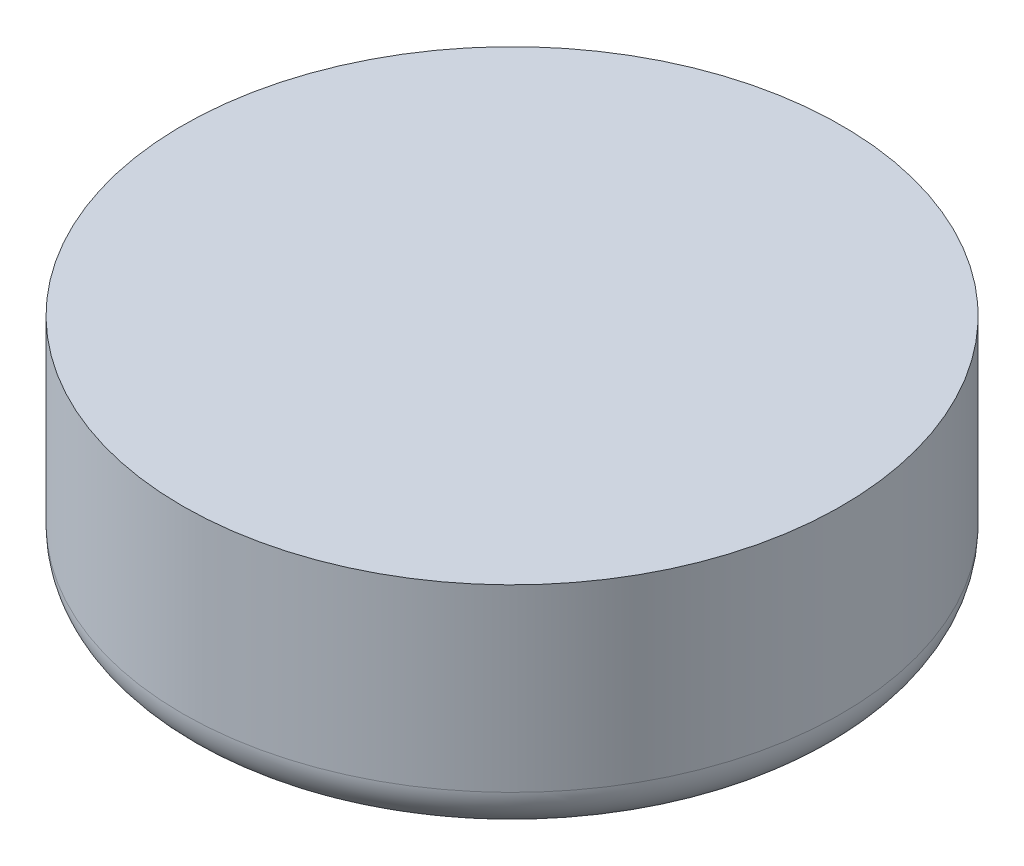
ISO-10303-21;
HEADER;
FILE_DESCRIPTION(('STEP AP214'),'2;1');
FILE_NAME('part.step','',(''),(''),'','','');
FILE_SCHEMA(('AUTOMOTIVE_DESIGN { 1 0 10303 214 1 1 1 1 }'));
ENDSEC;
DATA;
#1=APPLICATION_CONTEXT('core data for automotive mechanical design processes');
#2=APPLICATION_PROTOCOL_DEFINITION('international standard','automotive_design',2000,#1);
#3=PRODUCT_CONTEXT('',#1,'mechanical');
#4=PRODUCT('Part','Part','',(#3));
#5=PRODUCT_RELATED_PRODUCT_CATEGORY('part','',(#4));
#6=PRODUCT_DEFINITION_FORMATION('','',#4);
#7=PRODUCT_DEFINITION_CONTEXT('part definition',#1,'design');
#8=PRODUCT_DEFINITION('design','',#6,#7);
#9=PRODUCT_DEFINITION_SHAPE('','',#8);
#10=(LENGTH_UNIT() NAMED_UNIT(*) SI_UNIT(.MILLI.,.METRE.));
#11=(NAMED_UNIT(*) PLANE_ANGLE_UNIT() SI_UNIT($,.RADIAN.));
#12=(NAMED_UNIT(*) SI_UNIT($,.STERADIAN.) SOLID_ANGLE_UNIT());
#13=UNCERTAINTY_MEASURE_WITH_UNIT(LENGTH_MEASURE(1.E-05),#10,'distance_accuracy_value','');
#14=(GEOMETRIC_REPRESENTATION_CONTEXT(3) GLOBAL_UNCERTAINTY_ASSIGNED_CONTEXT((#13)) GLOBAL_UNIT_ASSIGNED_CONTEXT((#10,
#11,#12)) REPRESENTATION_CONTEXT('',''));
#15=CARTESIAN_POINT('',(0.,0.,0.));
#16=DIRECTION('',(0.,0.,1.));
#17=DIRECTION('',(1.,0.,0.));
#18=AXIS2_PLACEMENT_3D('',#15,#16,#17);
#19=CARTESIAN_POINT('',(0.,15.,0.));
#20=DIRECTION('',(0.,-1.,0.));
#21=DIRECTION('',(0.,0.,-1.));
#22=AXIS2_PLACEMENT_3D('',#19,#20,#21);
#23=CYLINDRICAL_SURFACE('',#22,22.);
#24=CARTESIAN_POINT('',(0.,3.,0.));
#25=DIRECTION('',(0.,1.,0.));
#26=DIRECTION('',(0.,0.,1.));
#27=AXIS2_PLACEMENT_3D('',#24,#25,#26);
#28=CIRCLE('',#27,22.);
#29=CARTESIAN_POINT('',(0.,3.,22.));
#30=VERTEX_POINT('',#29);
#31=EDGE_CURVE('E42',#30,#30,#28,.T.);
#32=ORIENTED_EDGE('',*,*,#31,.T.);
#33=EDGE_LOOP('',(#32));
#34=FACE_BOUND('',#33,.T.);
#35=CARTESIAN_POINT('',(0.,15.,0.));
#36=DIRECTION('',(0.,1.,0.));
#37=DIRECTION('',(0.,0.,1.));
#38=AXIS2_PLACEMENT_3D('',#35,#36,#37);
#39=CIRCLE('',#38,22.);
#40=CARTESIAN_POINT('',(0.,15.,22.));
#41=VERTEX_POINT('',#40);
#42=EDGE_CURVE('E47',#41,#41,#39,.T.);
#43=ORIENTED_EDGE('',*,*,#42,.F.);
#44=EDGE_LOOP('',(#43));
#45=FACE_BOUND('',#44,.T.);
#46=ADVANCED_FACE('F34',(#34,#45),#23,.T.);
#47=CARTESIAN_POINT('',(0.,15.,0.));
#48=DIRECTION('',(0.,1.,0.));
#49=DIRECTION('',(0.,0.,1.));
#50=AXIS2_PLACEMENT_3D('',#47,#48,#49);
#51=PLANE('',#50);
#52=ORIENTED_EDGE('',*,*,#42,.T.);
#53=EDGE_LOOP('',(#52));
#54=FACE_BOUND('',#53,.T.);
#55=ADVANCED_FACE('F55',(#54),#51,.T.);
#56=CARTESIAN_POINT('',(0.,0.,0.));
#57=DIRECTION('',(0.,1.,0.));
#58=DIRECTION('',(0.,0.,1.));
#59=AXIS2_PLACEMENT_3D('',#56,#57,#58);
#60=PLANE('',#59);
#61=CARTESIAN_POINT('',(0.,0.,0.));
#62=DIRECTION('',(0.,1.,0.));
#63=DIRECTION('',(0.,0.,1.));
#64=AXIS2_PLACEMENT_3D('',#61,#62,#63);
#65=CIRCLE('',#64,19.);
#66=CARTESIAN_POINT('',(0.,0.,19.));
#67=VERTEX_POINT('',#66);
#68=EDGE_CURVE('E10',#67,#67,#65,.F.);
#69=ORIENTED_EDGE('',*,*,#68,.T.);
#70=EDGE_LOOP('',(#69));
#71=FACE_BOUND('',#70,.T.);
#72=ADVANCED_FACE('F61',(#71),#60,.F.);
#73=CARTESIAN_POINT('',(0.,3.,0.));
#74=DIRECTION('',(0.,1.,0.));
#75=DIRECTION('',(0.,0.,1.));
#76=AXIS2_PLACEMENT_3D('',#73,#74,#75);
#77=TOROIDAL_SURFACE('',#76,19.,3.);
#78=ORIENTED_EDGE('',*,*,#68,.F.);
#79=EDGE_LOOP('',(#78));
#80=FACE_BOUND('',#79,.T.);
#81=ORIENTED_EDGE('',*,*,#31,.F.);
#82=EDGE_LOOP('',(#81));
#83=FACE_BOUND('',#82,.T.);
#84=ADVANCED_FACE('F36',(#80,#83),#77,.T.);
#85=CLOSED_SHELL('',(#46,#55,#72,#84));
#86=MANIFOLD_SOLID_BREP('B2',#85);
#87=ADVANCED_BREP_SHAPE_REPRESENTATION('',(#18,#86),#14);
#88=SHAPE_DEFINITION_REPRESENTATION(#9,#87);
ENDSEC;
END-ISO-10303-21;
